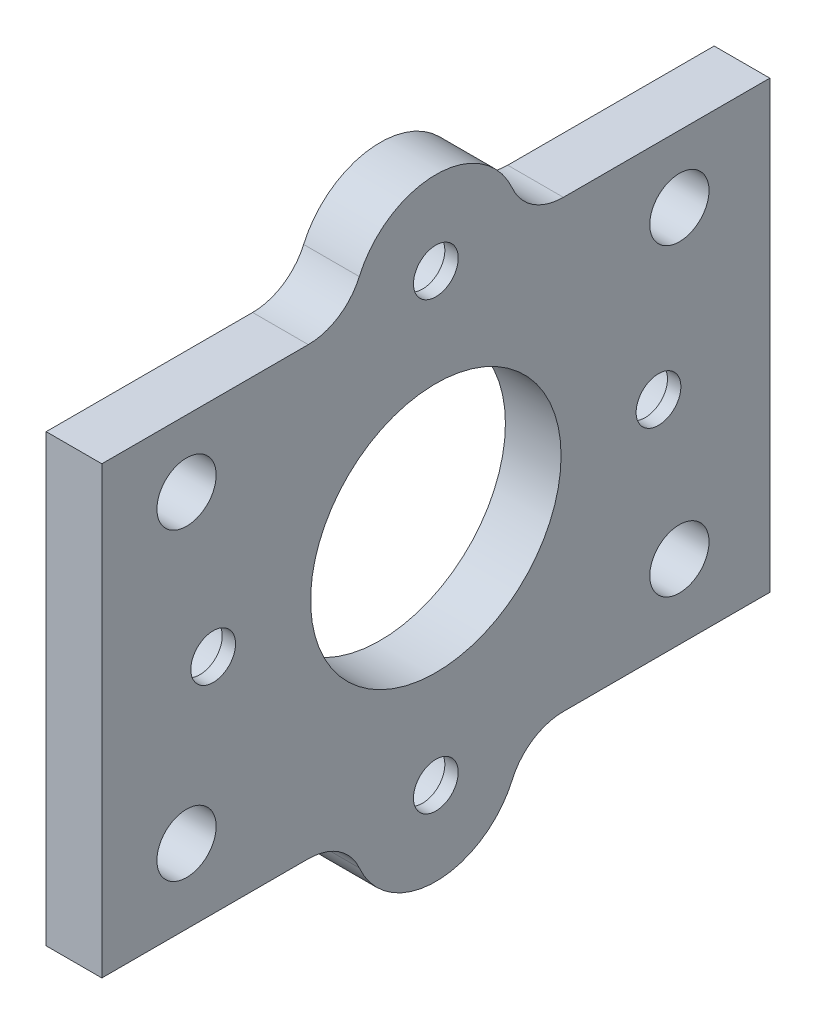
ISO-10303-21;
HEADER;
FILE_DESCRIPTION(('STEP AP214'),'2;1');
FILE_NAME('part.step','',(''),(''),'','','');
FILE_SCHEMA(('AUTOMOTIVE_DESIGN { 1 0 10303 214 1 1 1 1 }'));
ENDSEC;
DATA;
#1=APPLICATION_CONTEXT('core data for automotive mechanical design processes');
#2=APPLICATION_PROTOCOL_DEFINITION('international standard','automotive_design',2000,#1);
#3=PRODUCT_CONTEXT('',#1,'mechanical');
#4=PRODUCT('Part','Part','',(#3));
#5=PRODUCT_RELATED_PRODUCT_CATEGORY('part','',(#4));
#6=PRODUCT_DEFINITION_FORMATION('','',#4);
#7=PRODUCT_DEFINITION_CONTEXT('part definition',#1,'design');
#8=PRODUCT_DEFINITION('design','',#6,#7);
#9=PRODUCT_DEFINITION_SHAPE('','',#8);
#10=(LENGTH_UNIT() NAMED_UNIT(*) SI_UNIT(.MILLI.,.METRE.));
#11=(NAMED_UNIT(*) PLANE_ANGLE_UNIT() SI_UNIT($,.RADIAN.));
#12=(NAMED_UNIT(*) SI_UNIT($,.STERADIAN.) SOLID_ANGLE_UNIT());
#13=UNCERTAINTY_MEASURE_WITH_UNIT(LENGTH_MEASURE(1.E-05),#10,'distance_accuracy_value','');
#14=(GEOMETRIC_REPRESENTATION_CONTEXT(3) GLOBAL_UNCERTAINTY_ASSIGNED_CONTEXT((#13)) GLOBAL_UNIT_ASSIGNED_CONTEXT((#10,
#11,#12)) REPRESENTATION_CONTEXT('',''));
#15=CARTESIAN_POINT('',(0.,0.,0.));
#16=DIRECTION('',(0.,0.,1.));
#17=DIRECTION('',(1.,0.,0.));
#18=AXIS2_PLACEMENT_3D('',#15,#16,#17);
#19=CARTESIAN_POINT('',(0.,57.15,-23.5503221685152));
#20=DIRECTION('',(-1.,0.,0.));
#21=DIRECTION('',(0.,0.,1.));
#22=AXIS2_PLACEMENT_3D('',#19,#20,#21);
#23=PLANE('',#22);
#24=CARTESIAN_POINT('',(0.,43.1742956417217,-9.66112697324532));
#25=DIRECTION('',(1.,0.,0.));
#26=DIRECTION('',(0.,0.,-1.));
#27=AXIS2_PLACEMENT_3D('',#24,#25,#26);
#28=CIRCLE('',#27,3.3782);
#29=CARTESIAN_POINT('',(0.,43.1742956417217,-13.0393269732453));
#30=VERTEX_POINT('',#29);
#31=EDGE_CURVE('E341',#30,#30,#28,.T.);
#32=ORIENTED_EDGE('',*,*,#31,.T.);
#33=EDGE_LOOP('',(#32));
#34=FACE_BOUND('',#33,.T.);
#35=CARTESIAN_POINT('',(0.,43.1742956417217,-65.8840305557439));
#36=DIRECTION('',(1.,0.,0.));
#37=DIRECTION('',(0.,0.,-1.));
#38=AXIS2_PLACEMENT_3D('',#35,#36,#37);
#39=CIRCLE('',#38,3.3782);
#40=CARTESIAN_POINT('',(0.,43.1742956417217,-69.2622305557439));
#41=VERTEX_POINT('',#40);
#42=EDGE_CURVE('E351',#41,#41,#39,.T.);
#43=ORIENTED_EDGE('',*,*,#42,.T.);
#44=EDGE_LOOP('',(#43));
#45=FACE_BOUND('',#44,.T.);
#46=CARTESIAN_POINT('',(0.,8.46764467814933,-65.8840305557439));
#47=DIRECTION('',(1.,0.,0.));
#48=DIRECTION('',(0.,0.,-1.));
#49=AXIS2_PLACEMENT_3D('',#46,#47,#48);
#50=CIRCLE('',#49,3.3782);
#51=CARTESIAN_POINT('',(0.,8.46764467814933,-69.2622305557439));
#52=VERTEX_POINT('',#51);
#53=EDGE_CURVE('E357',#52,#52,#50,.T.);
#54=ORIENTED_EDGE('',*,*,#53,.T.);
#55=EDGE_LOOP('',(#54));
#56=FACE_BOUND('',#55,.T.);
#57=DIRECTION('',(0.,-1.,0.));
#58=VECTOR('',#57,1.);
#59=CARTESIAN_POINT('',(0.,0.,0.));
#60=LINE('',#59,#58);
#61=CARTESIAN_POINT('',(0.,50.8,0.));
#62=VERTEX_POINT('',#61);
#63=CARTESIAN_POINT('',(0.,0.,0.));
#64=VERTEX_POINT('',#63);
#65=EDGE_CURVE('E160',#62,#64,#60,.T.);
#66=ORIENTED_EDGE('',*,*,#65,.F.);
#67=DIRECTION('',(0.,0.,1.));
#68=VECTOR('',#67,1.);
#69=CARTESIAN_POINT('',(0.,50.8,0.));
#70=LINE('',#69,#68);
#71=CARTESIAN_POINT('',(0.,50.8,-23.5503221685152));
#72=VERTEX_POINT('',#71);
#73=EDGE_CURVE('E103',#72,#62,#70,.T.);
#74=ORIENTED_EDGE('',*,*,#73,.F.);
#75=CARTESIAN_POINT('',(0.,57.15,-23.5503221685152));
#76=DIRECTION('',(-1.,0.,0.));
#77=DIRECTION('',(0.,0.,1.));
#78=AXIS2_PLACEMENT_3D('',#75,#76,#77);
#79=CIRCLE('',#78,6.35);
#80=CARTESIAN_POINT('',(0.,54.61,-29.3701933011091));
#81=VERTEX_POINT('',#80);
#82=EDGE_CURVE('E97',#81,#72,#79,.T.);
#83=ORIENTED_EDGE('',*,*,#82,.F.);
#84=CARTESIAN_POINT('',(0.,50.8,-38.1));
#85=DIRECTION('',(1.,0.,0.));
#86=DIRECTION('',(0.,0.,1.));
#87=AXIS2_PLACEMENT_3D('',#84,#85,#86);
#88=CIRCLE('',#87,9.525);
#89=CARTESIAN_POINT('',(0.,54.61,-46.8298066988909));
#90=VERTEX_POINT('',#89);
#91=EDGE_CURVE('E150',#90,#81,#88,.T.);
#92=ORIENTED_EDGE('',*,*,#91,.F.);
#93=CARTESIAN_POINT('',(0.,57.15,-52.6496778314848));
#94=DIRECTION('',(-1.,0.,0.));
#95=DIRECTION('',(0.,0.,-1.));
#96=AXIS2_PLACEMENT_3D('',#93,#94,#95);
#97=CIRCLE('',#96,6.35);
#98=CARTESIAN_POINT('',(0.,50.8,-52.6496778314848));
#99=VERTEX_POINT('',#98);
#100=EDGE_CURVE('E178',#99,#90,#97,.T.);
#101=ORIENTED_EDGE('',*,*,#100,.F.);
#102=DIRECTION('',(0.,0.,1.));
#103=VECTOR('',#102,1.);
#104=CARTESIAN_POINT('',(0.,50.8,-52.6496778314848));
#105=LINE('',#104,#103);
#106=CARTESIAN_POINT('',(0.,50.8,-76.2));
#107=VERTEX_POINT('',#106);
#108=EDGE_CURVE('E176',#107,#99,#105,.T.);
#109=ORIENTED_EDGE('',*,*,#108,.F.);
#110=DIRECTION('',(0.,1.,0.));
#111=VECTOR('',#110,1.);
#112=CARTESIAN_POINT('',(0.,0.,-76.2));
#113=LINE('',#112,#111);
#114=CARTESIAN_POINT('',(0.,0.,-76.2));
#115=VERTEX_POINT('',#114);
#116=EDGE_CURVE('E174',#115,#107,#113,.T.);
#117=ORIENTED_EDGE('',*,*,#116,.F.);
#118=DIRECTION('',(0.,0.,-1.));
#119=VECTOR('',#118,1.);
#120=CARTESIAN_POINT('',(0.,0.,-52.6496778314848));
#121=LINE('',#120,#119);
#122=CARTESIAN_POINT('',(0.,0.,-52.6496778314848));
#123=VERTEX_POINT('',#122);
#124=EDGE_CURVE('E172',#123,#115,#121,.T.);
#125=ORIENTED_EDGE('',*,*,#124,.F.);
#126=CARTESIAN_POINT('',(0.,-6.35,-52.6496778314848));
#127=DIRECTION('',(-1.,0.,0.));
#128=DIRECTION('',(0.,0.,1.));
#129=AXIS2_PLACEMENT_3D('',#126,#127,#128);
#130=CIRCLE('',#129,6.35);
#131=CARTESIAN_POINT('',(0.,-3.81,-46.8298066988909));
#132=VERTEX_POINT('',#131);
#133=EDGE_CURVE('E170',#132,#123,#130,.T.);
#134=ORIENTED_EDGE('',*,*,#133,.F.);
#135=CARTESIAN_POINT('',(0.,0.,-38.1));
#136=DIRECTION('',(1.,0.,0.));
#137=DIRECTION('',(0.,0.,-1.));
#138=AXIS2_PLACEMENT_3D('',#135,#136,#137);
#139=CIRCLE('',#138,9.525);
#140=CARTESIAN_POINT('',(0.,-3.81,-29.3701933011091));
#141=VERTEX_POINT('',#140);
#142=EDGE_CURVE('E168',#141,#132,#139,.T.);
#143=ORIENTED_EDGE('',*,*,#142,.F.);
#144=CARTESIAN_POINT('',(0.,-6.35,-23.5503221685152));
#145=DIRECTION('',(-1.,0.,0.));
#146=DIRECTION('',(0.,0.,-1.));
#147=AXIS2_PLACEMENT_3D('',#144,#145,#146);
#148=CIRCLE('',#147,6.35);
#149=CARTESIAN_POINT('',(0.,0.,-23.5503221685152));
#150=VERTEX_POINT('',#149);
#151=EDGE_CURVE('E166',#150,#141,#148,.T.);
#152=ORIENTED_EDGE('',*,*,#151,.F.);
#153=DIRECTION('',(0.,0.,-1.));
#154=VECTOR('',#153,1.);
#155=CARTESIAN_POINT('',(0.,0.,0.));
#156=LINE('',#155,#154);
#157=EDGE_CURVE('E163',#64,#150,#156,.T.);
#158=ORIENTED_EDGE('',*,*,#157,.F.);
#159=EDGE_LOOP('',(#66,#74,#83,#92,#101,#109,#117,#125,#134,#143,#152,#158));
#160=FACE_BOUND('',#159,.T.);
#161=CARTESIAN_POINT('',(0.,25.4,-38.1));
#162=DIRECTION('',(1.,0.,0.));
#163=DIRECTION('',(0.,0.,-1.));
#164=AXIS2_PLACEMENT_3D('',#161,#162,#163);
#165=CIRCLE('',#164,14.2875);
#166=CARTESIAN_POINT('',(0.,25.4,-52.3875));
#167=VERTEX_POINT('',#166);
#168=EDGE_CURVE('E164',#167,#167,#165,.T.);
#169=ORIENTED_EDGE('',*,*,#168,.T.);
#170=EDGE_LOOP('',(#169));
#171=FACE_BOUND('',#170,.T.);
#172=CARTESIAN_POINT('',(0.,0.,-38.1000000000003));
#173=DIRECTION('',(-1.,0.,0.));
#174=DIRECTION('',(0.,0.,1.));
#175=AXIS2_PLACEMENT_3D('',#172,#173,#174);
#176=CIRCLE('',#175,4.7625);
#177=CARTESIAN_POINT('',(0.,0.,-33.3375000000003));
#178=VERTEX_POINT('',#177);
#179=EDGE_CURVE('E402',#178,#178,#176,.T.);
#180=ORIENTED_EDGE('',*,*,#179,.F.);
#181=EDGE_LOOP('',(#180));
#182=FACE_BOUND('',#181,.T.);
#183=CARTESIAN_POINT('',(0.,25.3999999999998,-12.7));
#184=DIRECTION('',(-1.,0.,0.));
#185=DIRECTION('',(0.,0.,1.));
#186=AXIS2_PLACEMENT_3D('',#183,#184,#185);
#187=CIRCLE('',#186,4.7625);
#188=CARTESIAN_POINT('',(0.,25.3999999999998,-7.9375));
#189=VERTEX_POINT('',#188);
#190=EDGE_CURVE('E390',#189,#189,#187,.T.);
#191=ORIENTED_EDGE('',*,*,#190,.F.);
#192=EDGE_LOOP('',(#191));
#193=FACE_BOUND('',#192,.T.);
#194=CARTESIAN_POINT('',(0.,50.8,-38.1));
#195=DIRECTION('',(-1.,0.,0.));
#196=DIRECTION('',(0.,0.,1.));
#197=AXIS2_PLACEMENT_3D('',#194,#195,#196);
#198=CIRCLE('',#197,4.7625);
#199=CARTESIAN_POINT('',(0.,50.8,-33.3375));
#200=VERTEX_POINT('',#199);
#201=EDGE_CURVE('E378',#200,#200,#198,.T.);
#202=ORIENTED_EDGE('',*,*,#201,.F.);
#203=EDGE_LOOP('',(#202));
#204=FACE_BOUND('',#203,.T.);
#205=CARTESIAN_POINT('',(0.,25.4,-63.5));
#206=DIRECTION('',(-1.,0.,0.));
#207=DIRECTION('',(0.,0.,1.));
#208=AXIS2_PLACEMENT_3D('',#205,#206,#207);
#209=CIRCLE('',#208,4.7625);
#210=CARTESIAN_POINT('',(0.,25.4,-58.7375));
#211=VERTEX_POINT('',#210);
#212=EDGE_CURVE('E366',#211,#211,#209,.T.);
#213=ORIENTED_EDGE('',*,*,#212,.F.);
#214=EDGE_LOOP('',(#213));
#215=FACE_BOUND('',#214,.T.);
#216=CARTESIAN_POINT('',(0.,8.46764467814933,-9.66112697324532));
#217=DIRECTION('',(1.,0.,0.));
#218=DIRECTION('',(0.,0.,-1.));
#219=AXIS2_PLACEMENT_3D('',#216,#217,#218);
#220=CIRCLE('',#219,3.3782);
#221=CARTESIAN_POINT('',(0.,8.46764467814933,-13.0393269732453));
#222=VERTEX_POINT('',#221);
#223=EDGE_CURVE('E363',#222,#222,#220,.T.);
#224=ORIENTED_EDGE('',*,*,#223,.T.);
#225=EDGE_LOOP('',(#224));
#226=FACE_BOUND('',#225,.T.);
#227=ADVANCED_FACE('F39',(#34,#45,#56,#160,#171,#182,#193,#204,#215,#226),#23,.T.);
#228=CARTESIAN_POINT('',(6.35,0.,0.));
#229=DIRECTION('',(0.,0.,-1.));
#230=DIRECTION('',(-1.,0.,0.));
#231=AXIS2_PLACEMENT_3D('',#228,#229,#230);
#232=PLANE('',#231);
#233=ORIENTED_EDGE('',*,*,#65,.T.);
#234=DIRECTION('',(-1.,0.,0.));
#235=VECTOR('',#234,1.);
#236=CARTESIAN_POINT('',(6.35,0.,0.));
#237=LINE('',#236,#235);
#238=CARTESIAN_POINT('',(6.35,0.,0.));
#239=VERTEX_POINT('',#238);
#240=EDGE_CURVE('E11',#239,#64,#237,.T.);
#241=ORIENTED_EDGE('',*,*,#240,.F.);
#242=DIRECTION('',(0.,-1.,0.));
#243=VECTOR('',#242,1.);
#244=CARTESIAN_POINT('',(6.35,0.,0.));
#245=LINE('',#244,#243);
#246=CARTESIAN_POINT('',(6.35,50.8,0.));
#247=VERTEX_POINT('',#246);
#248=EDGE_CURVE('E183',#247,#239,#245,.T.);
#249=ORIENTED_EDGE('',*,*,#248,.F.);
#250=DIRECTION('',(-1.,0.,0.));
#251=VECTOR('',#250,1.);
#252=CARTESIAN_POINT('',(6.35,50.8,0.));
#253=LINE('',#252,#251);
#254=EDGE_CURVE('E156',#247,#62,#253,.T.);
#255=ORIENTED_EDGE('',*,*,#254,.T.);
#256=EDGE_LOOP('',(#233,#241,#249,#255));
#257=FACE_BOUND('',#256,.T.);
#258=ADVANCED_FACE('F41',(#257),#232,.F.);
#259=CARTESIAN_POINT('',(6.35,0.,0.));
#260=DIRECTION('',(0.,1.,0.));
#261=DIRECTION('',(0.,0.,1.));
#262=AXIS2_PLACEMENT_3D('',#259,#260,#261);
#263=PLANE('',#262);
#264=ORIENTED_EDGE('',*,*,#157,.T.);
#265=DIRECTION('',(-1.,0.,0.));
#266=VECTOR('',#265,1.);
#267=CARTESIAN_POINT('',(6.35,0.,-23.5503221685152));
#268=LINE('',#267,#266);
#269=CARTESIAN_POINT('',(6.35,0.,-23.5503221685152));
#270=VERTEX_POINT('',#269);
#271=EDGE_CURVE('E48',#270,#150,#268,.T.);
#272=ORIENTED_EDGE('',*,*,#271,.F.);
#273=DIRECTION('',(0.,0.,-1.));
#274=VECTOR('',#273,1.);
#275=CARTESIAN_POINT('',(6.35,0.,0.));
#276=LINE('',#275,#274);
#277=EDGE_CURVE('E111',#239,#270,#276,.T.);
#278=ORIENTED_EDGE('',*,*,#277,.F.);
#279=ORIENTED_EDGE('',*,*,#240,.T.);
#280=EDGE_LOOP('',(#264,#272,#278,#279));
#281=FACE_BOUND('',#280,.T.);
#282=ADVANCED_FACE('F267',(#281),#263,.F.);
#283=CARTESIAN_POINT('',(6.35,-6.35,-23.5503221685152));
#284=DIRECTION('',(-1.,0.,0.));
#285=DIRECTION('',(0.,0.,1.));
#286=AXIS2_PLACEMENT_3D('',#283,#284,#285);
#287=CYLINDRICAL_SURFACE('',#286,6.35);
#288=ORIENTED_EDGE('',*,*,#151,.T.);
#289=DIRECTION('',(-1.,0.,0.));
#290=VECTOR('',#289,1.);
#291=CARTESIAN_POINT('',(6.35,-3.81,-29.3701933011091));
#292=LINE('',#291,#290);
#293=CARTESIAN_POINT('',(6.35,-3.81,-29.3701933011091));
#294=VERTEX_POINT('',#293);
#295=EDGE_CURVE('E202',#294,#141,#292,.T.);
#296=ORIENTED_EDGE('',*,*,#295,.F.);
#297=CARTESIAN_POINT('',(6.35,-6.35,-23.5503221685152));
#298=DIRECTION('',(-1.,0.,0.));
#299=DIRECTION('',(0.,0.,-1.));
#300=AXIS2_PLACEMENT_3D('',#297,#298,#299);
#301=CIRCLE('',#300,6.35);
#302=EDGE_CURVE('E210',#270,#294,#301,.T.);
#303=ORIENTED_EDGE('',*,*,#302,.F.);
#304=ORIENTED_EDGE('',*,*,#271,.T.);
#305=EDGE_LOOP('',(#288,#296,#303,#304));
#306=FACE_BOUND('',#305,.T.);
#307=ADVANCED_FACE('F208',(#306),#287,.F.);
#308=CARTESIAN_POINT('',(6.35,0.,-38.1));
#309=DIRECTION('',(-1.,0.,0.));
#310=DIRECTION('',(0.,0.,1.));
#311=AXIS2_PLACEMENT_3D('',#308,#309,#310);
#312=CYLINDRICAL_SURFACE('',#311,9.525);
#313=ORIENTED_EDGE('',*,*,#142,.T.);
#314=DIRECTION('',(-1.,0.,0.));
#315=VECTOR('',#314,1.);
#316=CARTESIAN_POINT('',(6.35,-3.81,-46.8298066988909));
#317=LINE('',#316,#315);
#318=CARTESIAN_POINT('',(6.35,-3.81,-46.8298066988909));
#319=VERTEX_POINT('',#318);
#320=EDGE_CURVE('E199',#319,#132,#317,.T.);
#321=ORIENTED_EDGE('',*,*,#320,.F.);
#322=CARTESIAN_POINT('',(6.35,0.,-38.1));
#323=DIRECTION('',(1.,0.,0.));
#324=DIRECTION('',(0.,0.,-1.));
#325=AXIS2_PLACEMENT_3D('',#322,#323,#324);
#326=CIRCLE('',#325,9.525);
#327=EDGE_CURVE('E228',#294,#319,#326,.T.);
#328=ORIENTED_EDGE('',*,*,#327,.F.);
#329=ORIENTED_EDGE('',*,*,#295,.T.);
#330=EDGE_LOOP('',(#313,#321,#328,#329));
#331=FACE_BOUND('',#330,.T.);
#332=ADVANCED_FACE('F219',(#331),#312,.T.);
#333=CARTESIAN_POINT('',(6.35,-6.35,-52.6496778314848));
#334=DIRECTION('',(-1.,0.,0.));
#335=DIRECTION('',(0.,0.,1.));
#336=AXIS2_PLACEMENT_3D('',#333,#334,#335);
#337=CYLINDRICAL_SURFACE('',#336,6.35);
#338=ORIENTED_EDGE('',*,*,#133,.T.);
#339=DIRECTION('',(-1.,0.,0.));
#340=VECTOR('',#339,1.);
#341=CARTESIAN_POINT('',(6.35,0.,-52.6496778314848));
#342=LINE('',#341,#340);
#343=CARTESIAN_POINT('',(6.35,0.,-52.6496778314848));
#344=VERTEX_POINT('',#343);
#345=EDGE_CURVE('E196',#344,#123,#342,.T.);
#346=ORIENTED_EDGE('',*,*,#345,.F.);
#347=CARTESIAN_POINT('',(6.35,-6.35,-52.6496778314848));
#348=DIRECTION('',(-1.,0.,0.));
#349=DIRECTION('',(0.,0.,1.));
#350=AXIS2_PLACEMENT_3D('',#347,#348,#349);
#351=CIRCLE('',#350,6.35);
#352=EDGE_CURVE('E225',#319,#344,#351,.T.);
#353=ORIENTED_EDGE('',*,*,#352,.F.);
#354=ORIENTED_EDGE('',*,*,#320,.T.);
#355=EDGE_LOOP('',(#338,#346,#353,#354));
#356=FACE_BOUND('',#355,.T.);
#357=ADVANCED_FACE('F223',(#356),#337,.F.);
#358=CARTESIAN_POINT('',(6.35,0.,-52.6496778314848));
#359=DIRECTION('',(0.,1.,0.));
#360=DIRECTION('',(0.,0.,1.));
#361=AXIS2_PLACEMENT_3D('',#358,#359,#360);
#362=PLANE('',#361);
#363=ORIENTED_EDGE('',*,*,#124,.T.);
#364=DIRECTION('',(-1.,0.,0.));
#365=VECTOR('',#364,1.);
#366=CARTESIAN_POINT('',(6.35,0.,-76.2));
#367=LINE('',#366,#365);
#368=CARTESIAN_POINT('',(6.35,0.,-76.2));
#369=VERTEX_POINT('',#368);
#370=EDGE_CURVE('E193',#369,#115,#367,.T.);
#371=ORIENTED_EDGE('',*,*,#370,.F.);
#372=DIRECTION('',(0.,0.,-1.));
#373=VECTOR('',#372,1.);
#374=CARTESIAN_POINT('',(6.35,0.,-52.6496778314848));
#375=LINE('',#374,#373);
#376=EDGE_CURVE('E227',#344,#369,#375,.T.);
#377=ORIENTED_EDGE('',*,*,#376,.F.);
#378=ORIENTED_EDGE('',*,*,#345,.T.);
#379=EDGE_LOOP('',(#363,#371,#377,#378));
#380=FACE_BOUND('',#379,.T.);
#381=ADVANCED_FACE('F663',(#380),#362,.F.);
#382=CARTESIAN_POINT('',(6.35,0.,-76.2));
#383=DIRECTION('',(0.,0.,1.));
#384=DIRECTION('',(1.,0.,0.));
#385=AXIS2_PLACEMENT_3D('',#382,#383,#384);
#386=PLANE('',#385);
#387=ORIENTED_EDGE('',*,*,#116,.T.);
#388=DIRECTION('',(-1.,0.,0.));
#389=VECTOR('',#388,1.);
#390=CARTESIAN_POINT('',(6.35,50.8,-76.2));
#391=LINE('',#390,#389);
#392=CARTESIAN_POINT('',(6.35,50.8,-76.2));
#393=VERTEX_POINT('',#392);
#394=EDGE_CURVE('E190',#393,#107,#391,.T.);
#395=ORIENTED_EDGE('',*,*,#394,.F.);
#396=DIRECTION('',(0.,1.,0.));
#397=VECTOR('',#396,1.);
#398=CARTESIAN_POINT('',(6.35,0.,-76.2));
#399=LINE('',#398,#397);
#400=EDGE_CURVE('E230',#369,#393,#399,.T.);
#401=ORIENTED_EDGE('',*,*,#400,.F.);
#402=ORIENTED_EDGE('',*,*,#370,.T.);
#403=EDGE_LOOP('',(#387,#395,#401,#402));
#404=FACE_BOUND('',#403,.T.);
#405=ADVANCED_FACE('F654',(#404),#386,.F.);
#406=CARTESIAN_POINT('',(6.35,50.8,-52.6496778314848));
#407=DIRECTION('',(0.,-1.,0.));
#408=DIRECTION('',(0.,0.,-1.));
#409=AXIS2_PLACEMENT_3D('',#406,#407,#408);
#410=PLANE('',#409);
#411=ORIENTED_EDGE('',*,*,#108,.T.);
#412=DIRECTION('',(-1.,0.,0.));
#413=VECTOR('',#412,1.);
#414=CARTESIAN_POINT('',(6.35,50.8,-52.6496778314848));
#415=LINE('',#414,#413);
#416=CARTESIAN_POINT('',(6.35,50.8,-52.6496778314848));
#417=VERTEX_POINT('',#416);
#418=EDGE_CURVE('E187',#417,#99,#415,.T.);
#419=ORIENTED_EDGE('',*,*,#418,.F.);
#420=DIRECTION('',(0.,0.,1.));
#421=VECTOR('',#420,1.);
#422=CARTESIAN_POINT('',(6.35,50.8,-52.6496778314848));
#423=LINE('',#422,#421);
#424=EDGE_CURVE('E236',#393,#417,#423,.T.);
#425=ORIENTED_EDGE('',*,*,#424,.F.);
#426=ORIENTED_EDGE('',*,*,#394,.T.);
#427=EDGE_LOOP('',(#411,#419,#425,#426));
#428=FACE_BOUND('',#427,.T.);
#429=ADVANCED_FACE('F242',(#428),#410,.F.);
#430=CARTESIAN_POINT('',(6.35,57.15,-52.6496778314848));
#431=DIRECTION('',(-1.,0.,0.));
#432=DIRECTION('',(0.,0.,1.));
#433=AXIS2_PLACEMENT_3D('',#430,#431,#432);
#434=CYLINDRICAL_SURFACE('',#433,6.35);
#435=ORIENTED_EDGE('',*,*,#100,.T.);
#436=DIRECTION('',(-1.,0.,0.));
#437=VECTOR('',#436,1.);
#438=CARTESIAN_POINT('',(6.35,54.61,-46.8298066988909));
#439=LINE('',#438,#437);
#440=CARTESIAN_POINT('',(6.35,54.61,-46.8298066988909));
#441=VERTEX_POINT('',#440);
#442=EDGE_CURVE('E151',#441,#90,#439,.T.);
#443=ORIENTED_EDGE('',*,*,#442,.F.);
#444=CARTESIAN_POINT('',(6.35,57.15,-52.6496778314848));
#445=DIRECTION('',(-1.,0.,0.));
#446=DIRECTION('',(0.,0.,-1.));
#447=AXIS2_PLACEMENT_3D('',#444,#445,#446);
#448=CIRCLE('',#447,6.35);
#449=EDGE_CURVE('E142',#417,#441,#448,.T.);
#450=ORIENTED_EDGE('',*,*,#449,.F.);
#451=ORIENTED_EDGE('',*,*,#418,.T.);
#452=EDGE_LOOP('',(#435,#443,#450,#451));
#453=FACE_BOUND('',#452,.T.);
#454=ADVANCED_FACE('F246',(#453),#434,.F.);
#455=CARTESIAN_POINT('',(6.35,50.8,-38.1));
#456=DIRECTION('',(-1.,0.,0.));
#457=DIRECTION('',(0.,0.,1.));
#458=AXIS2_PLACEMENT_3D('',#455,#456,#457);
#459=CYLINDRICAL_SURFACE('',#458,9.525);
#460=ORIENTED_EDGE('',*,*,#91,.T.);
#461=DIRECTION('',(-1.,0.,0.));
#462=VECTOR('',#461,1.);
#463=CARTESIAN_POINT('',(6.35,54.61,-29.3701933011091));
#464=LINE('',#463,#462);
#465=CARTESIAN_POINT('',(6.35,54.61,-29.3701933011091));
#466=VERTEX_POINT('',#465);
#467=EDGE_CURVE('E147',#466,#81,#464,.T.);
#468=ORIENTED_EDGE('',*,*,#467,.F.);
#469=CARTESIAN_POINT('',(6.35,50.8,-38.1));
#470=DIRECTION('',(1.,0.,0.));
#471=DIRECTION('',(0.,0.,1.));
#472=AXIS2_PLACEMENT_3D('',#469,#470,#471);
#473=CIRCLE('',#472,9.525);
#474=EDGE_CURVE('E136',#441,#466,#473,.T.);
#475=ORIENTED_EDGE('',*,*,#474,.F.);
#476=ORIENTED_EDGE('',*,*,#442,.T.);
#477=EDGE_LOOP('',(#460,#468,#475,#476));
#478=FACE_BOUND('',#477,.T.);
#479=ADVANCED_FACE('F148',(#478),#459,.T.);
#480=CARTESIAN_POINT('',(6.35,57.15,-23.5503221685152));
#481=DIRECTION('',(-1.,0.,0.));
#482=DIRECTION('',(0.,0.,1.));
#483=AXIS2_PLACEMENT_3D('',#480,#481,#482);
#484=CYLINDRICAL_SURFACE('',#483,6.35);
#485=ORIENTED_EDGE('',*,*,#82,.T.);
#486=DIRECTION('',(-1.,0.,0.));
#487=VECTOR('',#486,1.);
#488=CARTESIAN_POINT('',(6.35,50.8,-23.5503221685152));
#489=LINE('',#488,#487);
#490=CARTESIAN_POINT('',(6.35,50.8,-23.5503221685152));
#491=VERTEX_POINT('',#490);
#492=EDGE_CURVE('E152',#491,#72,#489,.T.);
#493=ORIENTED_EDGE('',*,*,#492,.F.);
#494=CARTESIAN_POINT('',(6.35,57.15,-23.5503221685152));
#495=DIRECTION('',(-1.,0.,0.));
#496=DIRECTION('',(0.,0.,1.));
#497=AXIS2_PLACEMENT_3D('',#494,#495,#496);
#498=CIRCLE('',#497,6.35);
#499=EDGE_CURVE('E140',#466,#491,#498,.T.);
#500=ORIENTED_EDGE('',*,*,#499,.F.);
#501=ORIENTED_EDGE('',*,*,#467,.T.);
#502=EDGE_LOOP('',(#485,#493,#500,#501));
#503=FACE_BOUND('',#502,.T.);
#504=ADVANCED_FACE('F154',(#503),#484,.F.);
#505=CARTESIAN_POINT('',(6.35,50.8,0.));
#506=DIRECTION('',(0.,-1.,0.));
#507=DIRECTION('',(0.,0.,-1.));
#508=AXIS2_PLACEMENT_3D('',#505,#506,#507);
#509=PLANE('',#508);
#510=ORIENTED_EDGE('',*,*,#73,.T.);
#511=ORIENTED_EDGE('',*,*,#254,.F.);
#512=DIRECTION('',(0.,0.,1.));
#513=VECTOR('',#512,1.);
#514=CARTESIAN_POINT('',(6.35,50.8,0.));
#515=LINE('',#514,#513);
#516=EDGE_CURVE('E56',#491,#247,#515,.T.);
#517=ORIENTED_EDGE('',*,*,#516,.F.);
#518=ORIENTED_EDGE('',*,*,#492,.T.);
#519=EDGE_LOOP('',(#510,#511,#517,#518));
#520=FACE_BOUND('',#519,.T.);
#521=ADVANCED_FACE('F250',(#520),#509,.F.);
#522=CARTESIAN_POINT('',(6.35,57.15,-23.5503221685152));
#523=DIRECTION('',(-1.,0.,0.));
#524=DIRECTION('',(0.,0.,1.));
#525=AXIS2_PLACEMENT_3D('',#522,#523,#524);
#526=PLANE('',#525);
#527=CARTESIAN_POINT('',(6.35,43.1742956417217,-9.66112697324532));
#528=DIRECTION('',(1.,0.,0.));
#529=DIRECTION('',(0.,0.,-1.));
#530=AXIS2_PLACEMENT_3D('',#527,#528,#529);
#531=CIRCLE('',#530,3.3782);
#532=CARTESIAN_POINT('',(6.35,43.1742956417217,-13.0393269732453));
#533=VERTEX_POINT('',#532);
#534=EDGE_CURVE('E344',#533,#533,#531,.T.);
#535=ORIENTED_EDGE('',*,*,#534,.F.);
#536=EDGE_LOOP('',(#535));
#537=FACE_BOUND('',#536,.T.);
#538=CARTESIAN_POINT('',(6.35,43.1742956417217,-65.8840305557439));
#539=DIRECTION('',(1.,0.,0.));
#540=DIRECTION('',(0.,0.,-1.));
#541=AXIS2_PLACEMENT_3D('',#538,#539,#540);
#542=CIRCLE('',#541,3.3782);
#543=CARTESIAN_POINT('',(6.35,43.1742956417217,-69.2622305557439));
#544=VERTEX_POINT('',#543);
#545=EDGE_CURVE('E346',#544,#544,#542,.T.);
#546=ORIENTED_EDGE('',*,*,#545,.F.);
#547=EDGE_LOOP('',(#546));
#548=FACE_BOUND('',#547,.T.);
#549=CARTESIAN_POINT('',(6.35,8.46764467814933,-65.8840305557439));
#550=DIRECTION('',(1.,0.,0.));
#551=DIRECTION('',(0.,0.,-1.));
#552=AXIS2_PLACEMENT_3D('',#549,#550,#551);
#553=CIRCLE('',#552,3.3782);
#554=CARTESIAN_POINT('',(6.35,8.46764467814933,-69.2622305557439));
#555=VERTEX_POINT('',#554);
#556=EDGE_CURVE('E354',#555,#555,#553,.T.);
#557=ORIENTED_EDGE('',*,*,#556,.F.);
#558=EDGE_LOOP('',(#557));
#559=FACE_BOUND('',#558,.T.);
#560=CARTESIAN_POINT('',(6.35,8.46764467814933,-9.66112697324532));
#561=DIRECTION('',(1.,0.,0.));
#562=DIRECTION('',(0.,0.,-1.));
#563=AXIS2_PLACEMENT_3D('',#560,#561,#562);
#564=CIRCLE('',#563,3.3782);
#565=CARTESIAN_POINT('',(6.35,8.46764467814933,-13.0393269732453));
#566=VERTEX_POINT('',#565);
#567=EDGE_CURVE('E360',#566,#566,#564,.T.);
#568=ORIENTED_EDGE('',*,*,#567,.F.);
#569=EDGE_LOOP('',(#568));
#570=FACE_BOUND('',#569,.T.);
#571=CARTESIAN_POINT('',(6.35,25.4,-63.5));
#572=DIRECTION('',(-1.,0.,0.));
#573=DIRECTION('',(0.,0.,1.));
#574=AXIS2_PLACEMENT_3D('',#571,#572,#573);
#575=CIRCLE('',#574,2.5527);
#576=CARTESIAN_POINT('',(6.35,25.4,-60.9473));
#577=VERTEX_POINT('',#576);
#578=EDGE_CURVE('E375',#577,#577,#575,.T.);
#579=ORIENTED_EDGE('',*,*,#578,.T.);
#580=EDGE_LOOP('',(#579));
#581=FACE_BOUND('',#580,.T.);
#582=CARTESIAN_POINT('',(6.35,50.8,-38.1));
#583=DIRECTION('',(-1.,0.,0.));
#584=DIRECTION('',(0.,0.,1.));
#585=AXIS2_PLACEMENT_3D('',#582,#583,#584);
#586=CIRCLE('',#585,2.5527);
#587=CARTESIAN_POINT('',(6.35,50.8,-35.5473));
#588=VERTEX_POINT('',#587);
#589=EDGE_CURVE('E387',#588,#588,#586,.T.);
#590=ORIENTED_EDGE('',*,*,#589,.T.);
#591=EDGE_LOOP('',(#590));
#592=FACE_BOUND('',#591,.T.);
#593=CARTESIAN_POINT('',(6.35,25.3999999999998,-12.7));
#594=DIRECTION('',(-1.,0.,0.));
#595=DIRECTION('',(0.,0.,1.));
#596=AXIS2_PLACEMENT_3D('',#593,#594,#595);
#597=CIRCLE('',#596,2.5527);
#598=CARTESIAN_POINT('',(6.35,25.3999999999998,-10.1473));
#599=VERTEX_POINT('',#598);
#600=EDGE_CURVE('E399',#599,#599,#597,.T.);
#601=ORIENTED_EDGE('',*,*,#600,.T.);
#602=EDGE_LOOP('',(#601));
#603=FACE_BOUND('',#602,.T.);
#604=CARTESIAN_POINT('',(6.35,0.,-38.1000000000003));
#605=DIRECTION('',(-1.,0.,0.));
#606=DIRECTION('',(0.,0.,1.));
#607=AXIS2_PLACEMENT_3D('',#604,#605,#606);
#608=CIRCLE('',#607,2.5527);
#609=CARTESIAN_POINT('',(6.35,0.,-35.5473000000003));
#610=VERTEX_POINT('',#609);
#611=EDGE_CURVE('E411',#610,#610,#608,.T.);
#612=ORIENTED_EDGE('',*,*,#611,.T.);
#613=EDGE_LOOP('',(#612));
#614=FACE_BOUND('',#613,.T.);
#615=CARTESIAN_POINT('',(6.35,25.4,-38.1));
#616=DIRECTION('',(1.,0.,0.));
#617=DIRECTION('',(0.,0.,-1.));
#618=AXIS2_PLACEMENT_3D('',#615,#616,#617);
#619=CIRCLE('',#618,14.2875);
#620=CARTESIAN_POINT('',(6.35,25.4,-52.3875));
#621=VERTEX_POINT('',#620);
#622=EDGE_CURVE('E414',#621,#621,#619,.T.);
#623=ORIENTED_EDGE('',*,*,#622,.F.);
#624=EDGE_LOOP('',(#623));
#625=FACE_BOUND('',#624,.T.);
#626=ORIENTED_EDGE('',*,*,#248,.T.);
#627=ORIENTED_EDGE('',*,*,#277,.T.);
#628=ORIENTED_EDGE('',*,*,#302,.T.);
#629=ORIENTED_EDGE('',*,*,#327,.T.);
#630=ORIENTED_EDGE('',*,*,#352,.T.);
#631=ORIENTED_EDGE('',*,*,#376,.T.);
#632=ORIENTED_EDGE('',*,*,#400,.T.);
#633=ORIENTED_EDGE('',*,*,#424,.T.);
#634=ORIENTED_EDGE('',*,*,#449,.T.);
#635=ORIENTED_EDGE('',*,*,#474,.T.);
#636=ORIENTED_EDGE('',*,*,#499,.T.);
#637=ORIENTED_EDGE('',*,*,#516,.T.);
#638=EDGE_LOOP('',(#626,#627,#628,#629,#630,#631,#632,#633,#634,#635,#636,#637));
#639=FACE_BOUND('',#638,.T.);
#640=ADVANCED_FACE('F138',(#537,#548,#559,#570,#581,#592,#603,#614,#625,#639),#526,.F.);
#641=CARTESIAN_POINT('',(0.,25.4,-38.1));
#642=DIRECTION('',(1.,0.,0.));
#643=DIRECTION('',(0.,0.,-1.));
#644=AXIS2_PLACEMENT_3D('',#641,#642,#643);
#645=CYLINDRICAL_SURFACE('',#644,14.2875);
#646=ORIENTED_EDGE('',*,*,#168,.F.);
#647=EDGE_LOOP('',(#646));
#648=FACE_BOUND('',#647,.T.);
#649=ORIENTED_EDGE('',*,*,#622,.T.);
#650=EDGE_LOOP('',(#649));
#651=FACE_BOUND('',#650,.T.);
#652=ADVANCED_FACE('F257',(#648,#651),#645,.F.);
#653=CARTESIAN_POINT('',(0.,0.,-38.1000000000003));
#654=DIRECTION('',(-1.,0.,0.));
#655=DIRECTION('',(0.,0.,1.));
#656=AXIS2_PLACEMENT_3D('',#653,#654,#655);
#657=CYLINDRICAL_SURFACE('',#656,2.5527);
#658=ORIENTED_EDGE('',*,*,#611,.F.);
#659=EDGE_LOOP('',(#658));
#660=FACE_BOUND('',#659,.T.);
#661=CARTESIAN_POINT('',(4.826,0.,-38.1000000000003));
#662=DIRECTION('',(-1.,0.,0.));
#663=DIRECTION('',(0.,0.,1.));
#664=AXIS2_PLACEMENT_3D('',#661,#662,#663);
#665=CIRCLE('',#664,2.5527);
#666=CARTESIAN_POINT('',(4.826,0.,-35.5473000000003));
#667=VERTEX_POINT('',#666);
#668=EDGE_CURVE('E408',#667,#667,#665,.T.);
#669=ORIENTED_EDGE('',*,*,#668,.T.);
#670=EDGE_LOOP('',(#669));
#671=FACE_BOUND('',#670,.T.);
#672=ADVANCED_FACE('F273',(#660,#671),#657,.F.);
#673=CARTESIAN_POINT('',(4.826,2.5527,-38.1000000000003));
#674=DIRECTION('',(1.,0.,0.));
#675=DIRECTION('',(0.,0.,-1.));
#676=AXIS2_PLACEMENT_3D('',#673,#674,#675);
#677=PLANE('',#676);
#678=ORIENTED_EDGE('',*,*,#668,.F.);
#679=EDGE_LOOP('',(#678));
#680=FACE_BOUND('',#679,.T.);
#681=CARTESIAN_POINT('',(4.826,0.,-38.1000000000003));
#682=DIRECTION('',(-1.,0.,0.));
#683=DIRECTION('',(0.,0.,1.));
#684=AXIS2_PLACEMENT_3D('',#681,#682,#683);
#685=CIRCLE('',#684,4.7625);
#686=CARTESIAN_POINT('',(4.826,0.,-33.3375000000003));
#687=VERTEX_POINT('',#686);
#688=EDGE_CURVE('E405',#687,#687,#685,.T.);
#689=ORIENTED_EDGE('',*,*,#688,.T.);
#690=EDGE_LOOP('',(#689));
#691=FACE_BOUND('',#690,.T.);
#692=ADVANCED_FACE('F277',(#680,#691),#677,.F.);
#693=CARTESIAN_POINT('',(0.,0.,-38.1000000000003));
#694=DIRECTION('',(-1.,0.,0.));
#695=DIRECTION('',(0.,0.,1.));
#696=AXIS2_PLACEMENT_3D('',#693,#694,#695);
#697=CYLINDRICAL_SURFACE('',#696,4.7625);
#698=ORIENTED_EDGE('',*,*,#688,.F.);
#699=EDGE_LOOP('',(#698));
#700=FACE_BOUND('',#699,.T.);
#701=ORIENTED_EDGE('',*,*,#179,.T.);
#702=EDGE_LOOP('',(#701));
#703=FACE_BOUND('',#702,.T.);
#704=ADVANCED_FACE('F281',(#700,#703),#697,.F.);
#705=CARTESIAN_POINT('',(0.,25.3999999999998,-12.7));
#706=DIRECTION('',(-1.,0.,0.));
#707=DIRECTION('',(0.,0.,1.));
#708=AXIS2_PLACEMENT_3D('',#705,#706,#707);
#709=CYLINDRICAL_SURFACE('',#708,2.5527);
#710=ORIENTED_EDGE('',*,*,#600,.F.);
#711=EDGE_LOOP('',(#710));
#712=FACE_BOUND('',#711,.T.);
#713=CARTESIAN_POINT('',(4.826,25.3999999999998,-12.7));
#714=DIRECTION('',(-1.,0.,0.));
#715=DIRECTION('',(0.,0.,1.));
#716=AXIS2_PLACEMENT_3D('',#713,#714,#715);
#717=CIRCLE('',#716,2.5527);
#718=CARTESIAN_POINT('',(4.826,25.3999999999998,-10.1473));
#719=VERTEX_POINT('',#718);
#720=EDGE_CURVE('E396',#719,#719,#717,.T.);
#721=ORIENTED_EDGE('',*,*,#720,.T.);
#722=EDGE_LOOP('',(#721));
#723=FACE_BOUND('',#722,.T.);
#724=ADVANCED_FACE('F285',(#712,#723),#709,.F.);
#725=CARTESIAN_POINT('',(4.826,27.9526999999998,-12.7));
#726=DIRECTION('',(1.,0.,0.));
#727=DIRECTION('',(0.,0.,-1.));
#728=AXIS2_PLACEMENT_3D('',#725,#726,#727);
#729=PLANE('',#728);
#730=ORIENTED_EDGE('',*,*,#720,.F.);
#731=EDGE_LOOP('',(#730));
#732=FACE_BOUND('',#731,.T.);
#733=CARTESIAN_POINT('',(4.826,25.3999999999998,-12.7));
#734=DIRECTION('',(-1.,0.,0.));
#735=DIRECTION('',(0.,0.,1.));
#736=AXIS2_PLACEMENT_3D('',#733,#734,#735);
#737=CIRCLE('',#736,4.7625);
#738=CARTESIAN_POINT('',(4.826,25.3999999999998,-7.9375));
#739=VERTEX_POINT('',#738);
#740=EDGE_CURVE('E393',#739,#739,#737,.T.);
#741=ORIENTED_EDGE('',*,*,#740,.T.);
#742=EDGE_LOOP('',(#741));
#743=FACE_BOUND('',#742,.T.);
#744=ADVANCED_FACE('F289',(#732,#743),#729,.F.);
#745=CARTESIAN_POINT('',(0.,25.3999999999998,-12.7));
#746=DIRECTION('',(-1.,0.,0.));
#747=DIRECTION('',(0.,0.,1.));
#748=AXIS2_PLACEMENT_3D('',#745,#746,#747);
#749=CYLINDRICAL_SURFACE('',#748,4.7625);
#750=ORIENTED_EDGE('',*,*,#740,.F.);
#751=EDGE_LOOP('',(#750));
#752=FACE_BOUND('',#751,.T.);
#753=ORIENTED_EDGE('',*,*,#190,.T.);
#754=EDGE_LOOP('',(#753));
#755=FACE_BOUND('',#754,.T.);
#756=ADVANCED_FACE('F293',(#752,#755),#749,.F.);
#757=CARTESIAN_POINT('',(0.,50.8,-38.1));
#758=DIRECTION('',(-1.,0.,0.));
#759=DIRECTION('',(0.,0.,1.));
#760=AXIS2_PLACEMENT_3D('',#757,#758,#759);
#761=CYLINDRICAL_SURFACE('',#760,2.5527);
#762=ORIENTED_EDGE('',*,*,#589,.F.);
#763=EDGE_LOOP('',(#762));
#764=FACE_BOUND('',#763,.T.);
#765=CARTESIAN_POINT('',(4.826,50.8,-38.1));
#766=DIRECTION('',(-1.,0.,0.));
#767=DIRECTION('',(0.,0.,1.));
#768=AXIS2_PLACEMENT_3D('',#765,#766,#767);
#769=CIRCLE('',#768,2.5527);
#770=CARTESIAN_POINT('',(4.826,50.8,-35.5473));
#771=VERTEX_POINT('',#770);
#772=EDGE_CURVE('E384',#771,#771,#769,.T.);
#773=ORIENTED_EDGE('',*,*,#772,.T.);
#774=EDGE_LOOP('',(#773));
#775=FACE_BOUND('',#774,.T.);
#776=ADVANCED_FACE('F297',(#764,#775),#761,.F.);
#777=CARTESIAN_POINT('',(4.826,53.3527,-38.1));
#778=DIRECTION('',(1.,0.,0.));
#779=DIRECTION('',(0.,0.,-1.));
#780=AXIS2_PLACEMENT_3D('',#777,#778,#779);
#781=PLANE('',#780);
#782=ORIENTED_EDGE('',*,*,#772,.F.);
#783=EDGE_LOOP('',(#782));
#784=FACE_BOUND('',#783,.T.);
#785=CARTESIAN_POINT('',(4.826,50.8,-38.1));
#786=DIRECTION('',(-1.,0.,0.));
#787=DIRECTION('',(0.,0.,1.));
#788=AXIS2_PLACEMENT_3D('',#785,#786,#787);
#789=CIRCLE('',#788,4.7625);
#790=CARTESIAN_POINT('',(4.826,50.8,-33.3375));
#791=VERTEX_POINT('',#790);
#792=EDGE_CURVE('E381',#791,#791,#789,.T.);
#793=ORIENTED_EDGE('',*,*,#792,.T.);
#794=EDGE_LOOP('',(#793));
#795=FACE_BOUND('',#794,.T.);
#796=ADVANCED_FACE('F301',(#784,#795),#781,.F.);
#797=CARTESIAN_POINT('',(0.,50.8,-38.1));
#798=DIRECTION('',(-1.,0.,0.));
#799=DIRECTION('',(0.,0.,1.));
#800=AXIS2_PLACEMENT_3D('',#797,#798,#799);
#801=CYLINDRICAL_SURFACE('',#800,4.7625);
#802=ORIENTED_EDGE('',*,*,#792,.F.);
#803=EDGE_LOOP('',(#802));
#804=FACE_BOUND('',#803,.T.);
#805=ORIENTED_EDGE('',*,*,#201,.T.);
#806=EDGE_LOOP('',(#805));
#807=FACE_BOUND('',#806,.T.);
#808=ADVANCED_FACE('F305',(#804,#807),#801,.F.);
#809=CARTESIAN_POINT('',(0.,25.4,-63.5));
#810=DIRECTION('',(-1.,0.,0.));
#811=DIRECTION('',(0.,0.,1.));
#812=AXIS2_PLACEMENT_3D('',#809,#810,#811);
#813=CYLINDRICAL_SURFACE('',#812,2.5527);
#814=ORIENTED_EDGE('',*,*,#578,.F.);
#815=EDGE_LOOP('',(#814));
#816=FACE_BOUND('',#815,.T.);
#817=CARTESIAN_POINT('',(4.826,25.4,-63.5));
#818=DIRECTION('',(-1.,0.,0.));
#819=DIRECTION('',(0.,0.,1.));
#820=AXIS2_PLACEMENT_3D('',#817,#818,#819);
#821=CIRCLE('',#820,2.5527);
#822=CARTESIAN_POINT('',(4.826,25.4,-60.9473));
#823=VERTEX_POINT('',#822);
#824=EDGE_CURVE('E372',#823,#823,#821,.T.);
#825=ORIENTED_EDGE('',*,*,#824,.T.);
#826=EDGE_LOOP('',(#825));
#827=FACE_BOUND('',#826,.T.);
#828=ADVANCED_FACE('F309',(#816,#827),#813,.F.);
#829=CARTESIAN_POINT('',(4.826,27.9527,-63.5));
#830=DIRECTION('',(1.,0.,0.));
#831=DIRECTION('',(0.,0.,-1.));
#832=AXIS2_PLACEMENT_3D('',#829,#830,#831);
#833=PLANE('',#832);
#834=ORIENTED_EDGE('',*,*,#824,.F.);
#835=EDGE_LOOP('',(#834));
#836=FACE_BOUND('',#835,.T.);
#837=CARTESIAN_POINT('',(4.826,25.4,-63.5));
#838=DIRECTION('',(-1.,0.,0.));
#839=DIRECTION('',(0.,0.,1.));
#840=AXIS2_PLACEMENT_3D('',#837,#838,#839);
#841=CIRCLE('',#840,4.7625);
#842=CARTESIAN_POINT('',(4.826,25.4,-58.7375));
#843=VERTEX_POINT('',#842);
#844=EDGE_CURVE('E369',#843,#843,#841,.T.);
#845=ORIENTED_EDGE('',*,*,#844,.T.);
#846=EDGE_LOOP('',(#845));
#847=FACE_BOUND('',#846,.T.);
#848=ADVANCED_FACE('F313',(#836,#847),#833,.F.);
#849=CARTESIAN_POINT('',(0.,25.4,-63.5));
#850=DIRECTION('',(-1.,0.,0.));
#851=DIRECTION('',(0.,0.,1.));
#852=AXIS2_PLACEMENT_3D('',#849,#850,#851);
#853=CYLINDRICAL_SURFACE('',#852,4.7625);
#854=ORIENTED_EDGE('',*,*,#844,.F.);
#855=EDGE_LOOP('',(#854));
#856=FACE_BOUND('',#855,.T.);
#857=ORIENTED_EDGE('',*,*,#212,.T.);
#858=EDGE_LOOP('',(#857));
#859=FACE_BOUND('',#858,.T.);
#860=ADVANCED_FACE('F317',(#856,#859),#853,.F.);
#861=CARTESIAN_POINT('',(6.35,8.46764467814933,-9.66112697324532));
#862=DIRECTION('',(1.,0.,0.));
#863=DIRECTION('',(0.,0.,-1.));
#864=AXIS2_PLACEMENT_3D('',#861,#862,#863);
#865=CYLINDRICAL_SURFACE('',#864,3.3782);
#866=ORIENTED_EDGE('',*,*,#223,.F.);
#867=EDGE_LOOP('',(#866));
#868=FACE_BOUND('',#867,.T.);
#869=ORIENTED_EDGE('',*,*,#567,.T.);
#870=EDGE_LOOP('',(#869));
#871=FACE_BOUND('',#870,.T.);
#872=ADVANCED_FACE('F321',(#868,#871),#865,.F.);
#873=CARTESIAN_POINT('',(6.35,8.46764467814933,-65.8840305557439));
#874=DIRECTION('',(1.,0.,0.));
#875=DIRECTION('',(0.,0.,-1.));
#876=AXIS2_PLACEMENT_3D('',#873,#874,#875);
#877=CYLINDRICAL_SURFACE('',#876,3.3782);
#878=ORIENTED_EDGE('',*,*,#53,.F.);
#879=EDGE_LOOP('',(#878));
#880=FACE_BOUND('',#879,.T.);
#881=ORIENTED_EDGE('',*,*,#556,.T.);
#882=EDGE_LOOP('',(#881));
#883=FACE_BOUND('',#882,.T.);
#884=ADVANCED_FACE('F325',(#880,#883),#877,.F.);
#885=CARTESIAN_POINT('',(6.35,43.1742956417217,-65.8840305557439));
#886=DIRECTION('',(1.,0.,0.));
#887=DIRECTION('',(0.,0.,-1.));
#888=AXIS2_PLACEMENT_3D('',#885,#886,#887);
#889=CYLINDRICAL_SURFACE('',#888,3.3782);
#890=ORIENTED_EDGE('',*,*,#42,.F.);
#891=EDGE_LOOP('',(#890));
#892=FACE_BOUND('',#891,.T.);
#893=ORIENTED_EDGE('',*,*,#545,.T.);
#894=EDGE_LOOP('',(#893));
#895=FACE_BOUND('',#894,.T.);
#896=ADVANCED_FACE('F329',(#892,#895),#889,.F.);
#897=CARTESIAN_POINT('',(6.35,43.1742956417217,-9.66112697324532));
#898=DIRECTION('',(1.,0.,0.));
#899=DIRECTION('',(0.,0.,-1.));
#900=AXIS2_PLACEMENT_3D('',#897,#898,#899);
#901=CYLINDRICAL_SURFACE('',#900,3.3782);
#902=ORIENTED_EDGE('',*,*,#31,.F.);
#903=EDGE_LOOP('',(#902));
#904=FACE_BOUND('',#903,.T.);
#905=ORIENTED_EDGE('',*,*,#534,.T.);
#906=EDGE_LOOP('',(#905));
#907=FACE_BOUND('',#906,.T.);
#908=ADVANCED_FACE('F333',(#904,#907),#901,.F.);
#909=CLOSED_SHELL('',(#227,#258,#282,#307,#332,#357,#381,#405,#429,#454,#479,#504,#521,#640,
#652,#672,#692,#704,#724,#744,#756,#776,#796,#808,#828,#848,#860,#872,#884,#896,#908));
#910=MANIFOLD_SOLID_BREP('B2',#909);
#911=ADVANCED_BREP_SHAPE_REPRESENTATION('',(#18,#910),#14);
#912=SHAPE_DEFINITION_REPRESENTATION(#9,#911);
ENDSEC;
END-ISO-10303-21;
